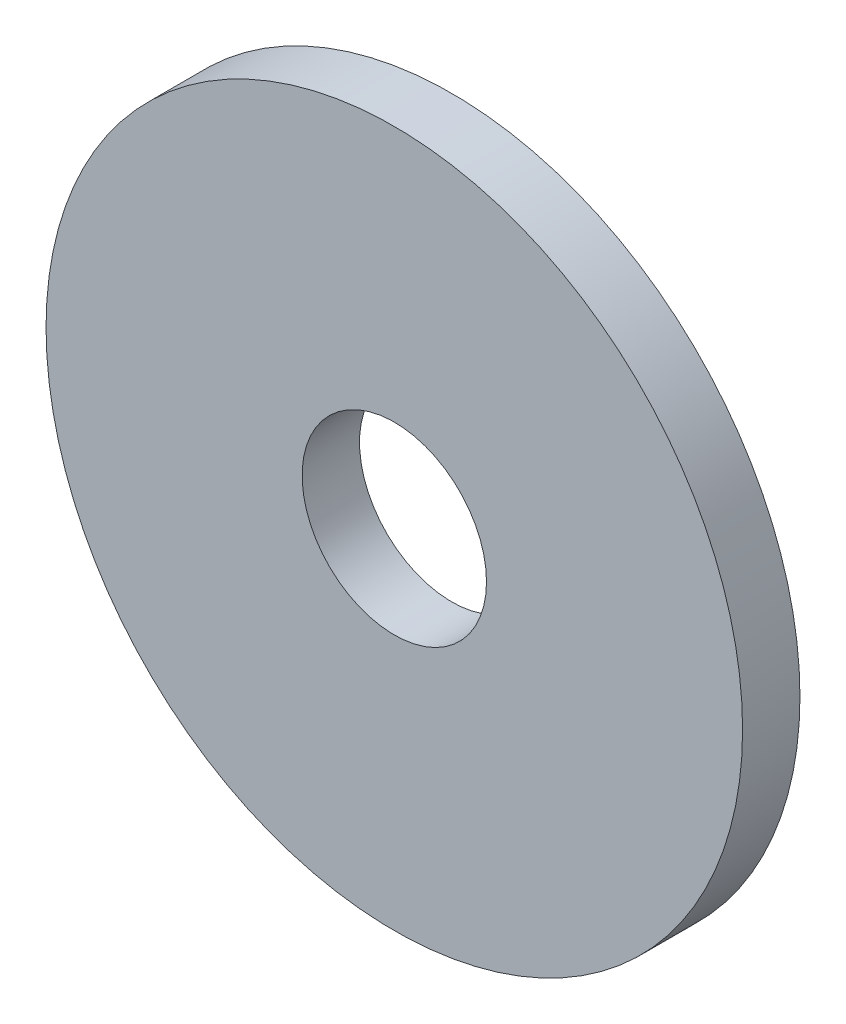
ISO-10303-21;
HEADER;
FILE_DESCRIPTION(('STEP AP214'),'2;1');
FILE_NAME('part.step','',(''),(''),'','','');
FILE_SCHEMA(('AUTOMOTIVE_DESIGN { 1 0 10303 214 1 1 1 1 }'));
ENDSEC;
DATA;
#1=APPLICATION_CONTEXT('core data for automotive mechanical design processes');
#2=APPLICATION_PROTOCOL_DEFINITION('international standard','automotive_design',2000,#1);
#3=PRODUCT_CONTEXT('',#1,'mechanical');
#4=PRODUCT('Part','Part','',(#3));
#5=PRODUCT_RELATED_PRODUCT_CATEGORY('part','',(#4));
#6=PRODUCT_DEFINITION_FORMATION('','',#4);
#7=PRODUCT_DEFINITION_CONTEXT('part definition',#1,'design');
#8=PRODUCT_DEFINITION('design','',#6,#7);
#9=PRODUCT_DEFINITION_SHAPE('','',#8);
#10=(LENGTH_UNIT() NAMED_UNIT(*) SI_UNIT(.MILLI.,.METRE.));
#11=(NAMED_UNIT(*) PLANE_ANGLE_UNIT() SI_UNIT($,.RADIAN.));
#12=(NAMED_UNIT(*) SI_UNIT($,.STERADIAN.) SOLID_ANGLE_UNIT());
#13=UNCERTAINTY_MEASURE_WITH_UNIT(LENGTH_MEASURE(1.E-05),#10,'distance_accuracy_value','');
#14=(GEOMETRIC_REPRESENTATION_CONTEXT(3) GLOBAL_UNCERTAINTY_ASSIGNED_CONTEXT((#13)) GLOBAL_UNIT_ASSIGNED_CONTEXT((#10,
#11,#12)) REPRESENTATION_CONTEXT('',''));
#15=CARTESIAN_POINT('',(0.,0.,0.));
#16=DIRECTION('',(0.,0.,1.));
#17=DIRECTION('',(1.,0.,0.));
#18=AXIS2_PLACEMENT_3D('',#15,#16,#17);
#19=CARTESIAN_POINT('',(0.,0.,1.4));
#20=DIRECTION('',(0.,0.,1.));
#21=DIRECTION('',(1.,0.,0.));
#22=AXIS2_PLACEMENT_3D('',#19,#20,#21);
#23=PLANE('',#22);
#24=CARTESIAN_POINT('',(0.,0.,1.4));
#25=DIRECTION('',(0.,0.,1.));
#26=DIRECTION('',(1.,0.,0.));
#27=AXIS2_PLACEMENT_3D('',#24,#25,#26);
#28=CIRCLE('',#27,8.5);
#29=CARTESIAN_POINT('',(8.5,0.,1.4));
#30=VERTEX_POINT('',#29);
#31=EDGE_CURVE('E10',#30,#30,#28,.T.);
#32=ORIENTED_EDGE('',*,*,#31,.T.);
#33=EDGE_LOOP('',(#32));
#34=FACE_BOUND('',#33,.T.);
#35=CARTESIAN_POINT('',(0.,0.,1.4));
#36=DIRECTION('',(0.,0.,1.));
#37=DIRECTION('',(1.,0.,0.));
#38=AXIS2_PLACEMENT_3D('',#35,#36,#37);
#39=CIRCLE('',#38,2.25);
#40=CARTESIAN_POINT('',(2.25,0.,1.4));
#41=VERTEX_POINT('',#40);
#42=EDGE_CURVE('E48',#41,#41,#39,.T.);
#43=ORIENTED_EDGE('',*,*,#42,.F.);
#44=EDGE_LOOP('',(#43));
#45=FACE_BOUND('',#44,.T.);
#46=ADVANCED_FACE('F37',(#34,#45),#23,.T.);
#47=CARTESIAN_POINT('',(0.,0.,0.));
#48=DIRECTION('',(0.,0.,1.));
#49=DIRECTION('',(1.,0.,0.));
#50=AXIS2_PLACEMENT_3D('',#47,#48,#49);
#51=PLANE('',#50);
#52=CARTESIAN_POINT('',(0.,0.,0.));
#53=DIRECTION('',(0.,0.,1.));
#54=DIRECTION('',(1.,0.,0.));
#55=AXIS2_PLACEMENT_3D('',#52,#53,#54);
#56=CIRCLE('',#55,8.5);
#57=CARTESIAN_POINT('',(8.5,0.,0.));
#58=VERTEX_POINT('',#57);
#59=EDGE_CURVE('E41',#58,#58,#56,.T.);
#60=ORIENTED_EDGE('',*,*,#59,.F.);
#61=EDGE_LOOP('',(#60));
#62=FACE_BOUND('',#61,.T.);
#63=CARTESIAN_POINT('',(0.,0.,0.));
#64=DIRECTION('',(0.,0.,1.));
#65=DIRECTION('',(1.,0.,0.));
#66=AXIS2_PLACEMENT_3D('',#63,#64,#65);
#67=CIRCLE('',#66,2.25);
#68=CARTESIAN_POINT('',(2.25,0.,0.));
#69=VERTEX_POINT('',#68);
#70=EDGE_CURVE('E50',#69,#69,#67,.T.);
#71=ORIENTED_EDGE('',*,*,#70,.T.);
#72=EDGE_LOOP('',(#71));
#73=FACE_BOUND('',#72,.T.);
#74=ADVANCED_FACE('F60',(#62,#73),#51,.F.);
#75=CARTESIAN_POINT('',(0.,0.,1.4));
#76=DIRECTION('',(0.,0.,-1.));
#77=DIRECTION('',(-1.,0.,0.));
#78=AXIS2_PLACEMENT_3D('',#75,#76,#77);
#79=CYLINDRICAL_SURFACE('',#78,8.5);
#80=ORIENTED_EDGE('',*,*,#31,.F.);
#81=EDGE_LOOP('',(#80));
#82=FACE_BOUND('',#81,.T.);
#83=ORIENTED_EDGE('',*,*,#59,.T.);
#84=EDGE_LOOP('',(#83));
#85=FACE_BOUND('',#84,.T.);
#86=ADVANCED_FACE('F39',(#82,#85),#79,.T.);
#87=CARTESIAN_POINT('',(0.,0.,1.4));
#88=DIRECTION('',(0.,0.,-1.));
#89=DIRECTION('',(-1.,0.,0.));
#90=AXIS2_PLACEMENT_3D('',#87,#88,#89);
#91=CYLINDRICAL_SURFACE('',#90,2.25);
#92=ORIENTED_EDGE('',*,*,#42,.T.);
#93=EDGE_LOOP('',(#92));
#94=FACE_BOUND('',#93,.T.);
#95=ORIENTED_EDGE('',*,*,#70,.F.);
#96=EDGE_LOOP('',(#95));
#97=FACE_BOUND('',#96,.T.);
#98=ADVANCED_FACE('F56',(#94,#97),#91,.F.);
#99=CLOSED_SHELL('',(#46,#74,#86,#98));
#100=MANIFOLD_SOLID_BREP('B2',#99);
#101=ADVANCED_BREP_SHAPE_REPRESENTATION('',(#18,#100),#14);
#102=SHAPE_DEFINITION_REPRESENTATION(#9,#101);
ENDSEC;
END-ISO-10303-21;
